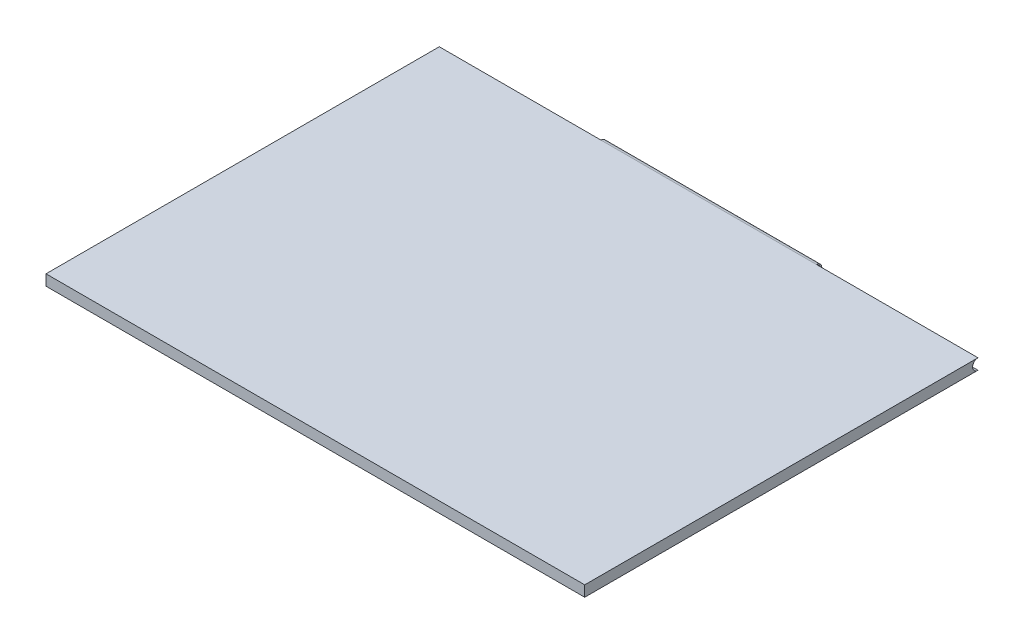
ISO-10303-21;
HEADER;
FILE_DESCRIPTION(('STEP AP214'),'2;1');
FILE_NAME('part.step','',(''),(''),'','','');
FILE_SCHEMA(('AUTOMOTIVE_DESIGN { 1 0 10303 214 1 1 1 1 }'));
ENDSEC;
DATA;
#1=APPLICATION_CONTEXT('core data for automotive mechanical design processes');
#2=APPLICATION_PROTOCOL_DEFINITION('international standard','automotive_design',2000,#1);
#3=PRODUCT_CONTEXT('',#1,'mechanical');
#4=PRODUCT('Part','Part','',(#3));
#5=PRODUCT_RELATED_PRODUCT_CATEGORY('part','',(#4));
#6=PRODUCT_DEFINITION_FORMATION('','',#4);
#7=PRODUCT_DEFINITION_CONTEXT('part definition',#1,'design');
#8=PRODUCT_DEFINITION('design','',#6,#7);
#9=PRODUCT_DEFINITION_SHAPE('','',#8);
#10=(LENGTH_UNIT() NAMED_UNIT(*) SI_UNIT(.MILLI.,.METRE.));
#11=(NAMED_UNIT(*) PLANE_ANGLE_UNIT() SI_UNIT($,.RADIAN.));
#12=(NAMED_UNIT(*) SI_UNIT($,.STERADIAN.) SOLID_ANGLE_UNIT());
#13=UNCERTAINTY_MEASURE_WITH_UNIT(LENGTH_MEASURE(1.E-05),#10,'distance_accuracy_value','');
#14=(GEOMETRIC_REPRESENTATION_CONTEXT(3) GLOBAL_UNCERTAINTY_ASSIGNED_CONTEXT((#13)) GLOBAL_UNIT_ASSIGNED_CONTEXT((#10,
#11,#12)) REPRESENTATION_CONTEXT('',''));
#15=CARTESIAN_POINT('',(0.,0.,0.));
#16=DIRECTION('',(0.,0.,1.));
#17=DIRECTION('',(1.,0.,0.));
#18=AXIS2_PLACEMENT_3D('',#15,#16,#17);
#19=CARTESIAN_POINT('',(-95.260663507109,2.,-80.1232227488151));
#20=DIRECTION('',(1.,0.,0.));
#21=DIRECTION('',(0.,0.,-1.));
#22=AXIS2_PLACEMENT_3D('',#19,#20,#21);
#23=CYLINDRICAL_SURFACE('',#22,2.);
#24=DIRECTION('',(-1.,0.,0.));
#25=VECTOR('',#24,1.);
#26=CARTESIAN_POINT('',(-95.260663507109,0.,-80.1232227488151));
#27=LINE('',#26,#25);
#28=CARTESIAN_POINT('',(44.739336492891,0.,-80.1232227488151));
#29=VERTEX_POINT('',#28);
#30=CARTESIAN_POINT('',(-35.260663507109,0.,-80.1232227488151));
#31=VERTEX_POINT('',#30);
#32=EDGE_CURVE('E124',#29,#31,#27,.T.);
#33=ORIENTED_EDGE('',*,*,#32,.T.);
#34=CARTESIAN_POINT('',(-35.260663507109,2.,-80.1232227488152));
#35=DIRECTION('',(-1.,0.,0.));
#36=DIRECTION('',(0.,0.,1.));
#37=AXIS2_PLACEMENT_3D('',#34,#35,#36);
#38=CIRCLE('',#37,2.);
#39=CARTESIAN_POINT('',(-35.260663507109,4.,-80.1232227488152));
#40=VERTEX_POINT('',#39);
#41=EDGE_CURVE('E56',#40,#31,#38,.T.);
#42=ORIENTED_EDGE('',*,*,#41,.F.);
#43=DIRECTION('',(-1.,0.,0.));
#44=VECTOR('',#43,1.);
#45=CARTESIAN_POINT('',(-95.260663507109,4.,-80.1232227488151));
#46=LINE('',#45,#44);
#47=CARTESIAN_POINT('',(44.739336492891,4.,-80.1232227488151));
#48=VERTEX_POINT('',#47);
#49=EDGE_CURVE('E115',#48,#40,#46,.T.);
#50=ORIENTED_EDGE('',*,*,#49,.F.);
#51=CARTESIAN_POINT('',(44.739336492891,2.,-80.1232227488151));
#52=DIRECTION('',(1.,0.,0.));
#53=DIRECTION('',(0.,0.,-1.));
#54=AXIS2_PLACEMENT_3D('',#51,#52,#53);
#55=CIRCLE('',#54,2.);
#56=EDGE_CURVE('E157',#29,#48,#55,.T.);
#57=ORIENTED_EDGE('',*,*,#56,.F.);
#58=EDGE_LOOP('',(#33,#42,#50,#57));
#59=FACE_BOUND('',#58,.T.);
#60=ADVANCED_FACE('F41',(#59),#23,.T.);
#61=CARTESIAN_POINT('',(-95.260663507109,2.,-80.1232227488151));
#62=DIRECTION('',(1.,0.,0.));
#63=DIRECTION('',(0.,0.,-1.));
#64=AXIS2_PLACEMENT_3D('',#61,#62,#63);
#65=CYLINDRICAL_SURFACE('',#64,1.5);
#66=CARTESIAN_POINT('',(44.739336492891,2.,-80.1232227488151));
#67=DIRECTION('',(1.,0.,0.));
#68=DIRECTION('',(0.,0.,-1.));
#69=AXIS2_PLACEMENT_3D('',#66,#67,#68);
#70=CIRCLE('',#69,1.5);
#71=CARTESIAN_POINT('',(44.739336492891,2.,-81.6232227488151));
#72=VERTEX_POINT('',#71);
#73=EDGE_CURVE('E45',#72,#72,#70,.F.);
#74=ORIENTED_EDGE('',*,*,#73,.F.);
#75=EDGE_LOOP('',(#74));
#76=FACE_BOUND('',#75,.T.);
#77=CARTESIAN_POINT('',(-35.260663507109,2.,-80.1232227488151));
#78=DIRECTION('',(-1.,0.,0.));
#79=DIRECTION('',(0.,0.,1.));
#80=AXIS2_PLACEMENT_3D('',#77,#78,#79);
#81=CIRCLE('',#80,1.5);
#82=CARTESIAN_POINT('',(-35.260663507109,2.,-78.6232227488151));
#83=VERTEX_POINT('',#82);
#84=EDGE_CURVE('E117',#83,#83,#81,.F.);
#85=ORIENTED_EDGE('',*,*,#84,.F.);
#86=EDGE_LOOP('',(#85));
#87=FACE_BOUND('',#86,.T.);
#88=ADVANCED_FACE('F167',(#76,#87),#65,.F.);
#89=CARTESIAN_POINT('',(-95.260663507109,4.,-80.1232227488151));
#90=DIRECTION('',(1.,0.,0.));
#91=DIRECTION('',(0.,0.,-1.));
#92=AXIS2_PLACEMENT_3D('',#89,#90,#91);
#93=PLANE('',#92);
#94=DIRECTION('',(0.,0.,1.));
#95=VECTOR('',#94,1.);
#96=CARTESIAN_POINT('',(-95.260663507109,4.,-80.1232227488151));
#97=LINE('',#96,#95);
#98=CARTESIAN_POINT('',(-95.260663507109,4.,-80.1232227488151));
#99=VERTEX_POINT('',#98);
#100=CARTESIAN_POINT('',(-95.260663507109,4.,65.8767772511848));
#101=VERTEX_POINT('',#100);
#102=EDGE_CURVE('E111',#99,#101,#97,.T.);
#103=ORIENTED_EDGE('',*,*,#102,.F.);
#104=CARTESIAN_POINT('',(-95.260663507109,2.,-80.1232227488151));
#105=DIRECTION('',(-1.,0.,0.));
#106=DIRECTION('',(0.,0.,1.));
#107=AXIS2_PLACEMENT_3D('',#104,#105,#106);
#108=CIRCLE('',#107,2.);
#109=CARTESIAN_POINT('',(-95.260663507109,0.,-80.1232227488151));
#110=VERTEX_POINT('',#109);
#111=EDGE_CURVE('E95',#110,#99,#108,.T.);
#112=ORIENTED_EDGE('',*,*,#111,.F.);
#113=DIRECTION('',(0.,0.,1.));
#114=VECTOR('',#113,1.);
#115=CARTESIAN_POINT('',(-95.260663507109,0.,-80.1232227488151));
#116=LINE('',#115,#114);
#117=CARTESIAN_POINT('',(-95.260663507109,0.,65.8767772511848));
#118=VERTEX_POINT('',#117);
#119=EDGE_CURVE('E133',#110,#118,#116,.T.);
#120=ORIENTED_EDGE('',*,*,#119,.T.);
#121=DIRECTION('',(0.,-1.,0.));
#122=VECTOR('',#121,1.);
#123=CARTESIAN_POINT('',(-95.260663507109,4.,65.8767772511848));
#124=LINE('',#123,#122);
#125=EDGE_CURVE('E12',#101,#118,#124,.T.);
#126=ORIENTED_EDGE('',*,*,#125,.F.);
#127=EDGE_LOOP('',(#103,#112,#120,#126));
#128=FACE_BOUND('',#127,.T.);
#129=ADVANCED_FACE('F43',(#128),#93,.F.);
#130=CARTESIAN_POINT('',(-95.260663507109,4.,65.8767772511848));
#131=DIRECTION('',(0.,0.,-1.));
#132=DIRECTION('',(-1.,0.,0.));
#133=AXIS2_PLACEMENT_3D('',#130,#131,#132);
#134=PLANE('',#133);
#135=DIRECTION('',(1.,0.,0.));
#136=VECTOR('',#135,1.);
#137=CARTESIAN_POINT('',(-95.260663507109,0.,65.8767772511848));
#138=LINE('',#137,#136);
#139=CARTESIAN_POINT('',(104.739336492891,0.,65.8767772511848));
#140=VERTEX_POINT('',#139);
#141=EDGE_CURVE('E135',#118,#140,#138,.T.);
#142=ORIENTED_EDGE('',*,*,#141,.T.);
#143=DIRECTION('',(0.,-1.,0.));
#144=VECTOR('',#143,1.);
#145=CARTESIAN_POINT('',(104.739336492891,4.,65.8767772511848));
#146=LINE('',#145,#144);
#147=CARTESIAN_POINT('',(104.739336492891,4.,65.8767772511848));
#148=VERTEX_POINT('',#147);
#149=EDGE_CURVE('E50',#148,#140,#146,.T.);
#150=ORIENTED_EDGE('',*,*,#149,.F.);
#151=DIRECTION('',(1.,0.,0.));
#152=VECTOR('',#151,1.);
#153=CARTESIAN_POINT('',(-95.260663507109,4.,65.8767772511848));
#154=LINE('',#153,#152);
#155=EDGE_CURVE('E119',#101,#148,#154,.T.);
#156=ORIENTED_EDGE('',*,*,#155,.F.);
#157=ORIENTED_EDGE('',*,*,#125,.T.);
#158=EDGE_LOOP('',(#142,#150,#156,#157));
#159=FACE_BOUND('',#158,.T.);
#160=ADVANCED_FACE('F175',(#159),#134,.F.);
#161=CARTESIAN_POINT('',(104.739336492891,4.,-80.1232227488151));
#162=DIRECTION('',(-1.,0.,0.));
#163=DIRECTION('',(0.,0.,1.));
#164=AXIS2_PLACEMENT_3D('',#161,#162,#163);
#165=PLANE('',#164);
#166=DIRECTION('',(0.,0.,-1.));
#167=VECTOR('',#166,1.);
#168=CARTESIAN_POINT('',(104.739336492891,0.,-80.1232227488151));
#169=LINE('',#168,#167);
#170=CARTESIAN_POINT('',(104.739336492891,0.,-80.1232227488151));
#171=VERTEX_POINT('',#170);
#172=EDGE_CURVE('E137',#140,#171,#169,.T.);
#173=ORIENTED_EDGE('',*,*,#172,.T.);
#174=CARTESIAN_POINT('',(104.739336492891,2.,-80.1232227488151));
#175=DIRECTION('',(1.,0.,0.));
#176=DIRECTION('',(0.,0.,-1.));
#177=AXIS2_PLACEMENT_3D('',#174,#175,#176);
#178=CIRCLE('',#177,2.);
#179=CARTESIAN_POINT('',(104.739336492891,4.,-80.1232227488151));
#180=VERTEX_POINT('',#179);
#181=EDGE_CURVE('E116',#180,#171,#178,.T.);
#182=ORIENTED_EDGE('',*,*,#181,.F.);
#183=DIRECTION('',(0.,0.,-1.));
#184=VECTOR('',#183,1.);
#185=CARTESIAN_POINT('',(104.739336492891,4.,-80.1232227488151));
#186=LINE('',#185,#184);
#187=EDGE_CURVE('E122',#148,#180,#186,.T.);
#188=ORIENTED_EDGE('',*,*,#187,.F.);
#189=ORIENTED_EDGE('',*,*,#149,.T.);
#190=EDGE_LOOP('',(#173,#182,#188,#189));
#191=FACE_BOUND('',#190,.T.);
#192=ADVANCED_FACE('F145',(#191),#165,.F.);
#193=CARTESIAN_POINT('',(0.,4.,0.));
#194=DIRECTION('',(0.,1.,0.));
#195=DIRECTION('',(0.,0.,1.));
#196=AXIS2_PLACEMENT_3D('',#193,#194,#195);
#197=PLANE('',#196);
#198=ORIENTED_EDGE('',*,*,#102,.T.);
#199=ORIENTED_EDGE('',*,*,#155,.T.);
#200=ORIENTED_EDGE('',*,*,#187,.T.);
#201=EDGE_CURVE('E131',#180,#48,#46,.T.);
#202=ORIENTED_EDGE('',*,*,#201,.T.);
#203=ORIENTED_EDGE('',*,*,#49,.T.);
#204=DIRECTION('',(-1.,0.,0.));
#205=VECTOR('',#204,1.);
#206=CARTESIAN_POINT('',(-35.260663507109,4.,-80.1232227488152));
#207=LINE('',#206,#205);
#208=EDGE_CURVE('E98',#40,#99,#207,.T.);
#209=ORIENTED_EDGE('',*,*,#208,.T.);
#210=EDGE_LOOP('',(#198,#199,#200,#202,#203,#209));
#211=FACE_BOUND('',#210,.T.);
#212=ADVANCED_FACE('F110',(#211),#197,.T.);
#213=CARTESIAN_POINT('',(0.,0.,0.));
#214=DIRECTION('',(0.,1.,0.));
#215=DIRECTION('',(0.,0.,1.));
#216=AXIS2_PLACEMENT_3D('',#213,#214,#215);
#217=PLANE('',#216);
#218=ORIENTED_EDGE('',*,*,#119,.F.);
#219=EDGE_CURVE('E100',#31,#110,#27,.T.);
#220=ORIENTED_EDGE('',*,*,#219,.F.);
#221=ORIENTED_EDGE('',*,*,#32,.F.);
#222=EDGE_CURVE('E120',#171,#29,#27,.T.);
#223=ORIENTED_EDGE('',*,*,#222,.F.);
#224=ORIENTED_EDGE('',*,*,#172,.F.);
#225=ORIENTED_EDGE('',*,*,#141,.F.);
#226=EDGE_LOOP('',(#218,#220,#221,#223,#224,#225));
#227=FACE_BOUND('',#226,.T.);
#228=ADVANCED_FACE('F150',(#227),#217,.F.);
#229=CARTESIAN_POINT('',(44.739336492891,2.,-80.1232227488151));
#230=DIRECTION('',(1.,0.,0.));
#231=DIRECTION('',(0.,0.,-1.));
#232=AXIS2_PLACEMENT_3D('',#229,#230,#231);
#233=PLANE('',#232);
#234=EDGE_CURVE('E63',#48,#29,#55,.T.);
#235=ORIENTED_EDGE('',*,*,#234,.T.);
#236=ORIENTED_EDGE('',*,*,#56,.T.);
#237=EDGE_LOOP('',(#235,#236));
#238=FACE_BOUND('',#237,.T.);
#239=ORIENTED_EDGE('',*,*,#73,.T.);
#240=EDGE_LOOP('',(#239));
#241=FACE_BOUND('',#240,.T.);
#242=ADVANCED_FACE('F185',(#238,#241),#233,.T.);
#243=CARTESIAN_POINT('',(44.739336492891,2.,-80.1232227488151));
#244=DIRECTION('',(1.,0.,0.));
#245=DIRECTION('',(0.,0.,-1.));
#246=AXIS2_PLACEMENT_3D('',#243,#244,#245);
#247=CYLINDRICAL_SURFACE('',#246,2.);
#248=ORIENTED_EDGE('',*,*,#201,.F.);
#249=ORIENTED_EDGE('',*,*,#181,.T.);
#250=ORIENTED_EDGE('',*,*,#222,.T.);
#251=ORIENTED_EDGE('',*,*,#234,.F.);
#252=EDGE_LOOP('',(#248,#249,#250,#251));
#253=FACE_BOUND('',#252,.T.);
#254=ADVANCED_FACE('F155',(#253),#247,.F.);
#255=CARTESIAN_POINT('',(-35.260663507109,2.,-80.1232227488152));
#256=DIRECTION('',(-1.,0.,0.));
#257=DIRECTION('',(0.,0.,1.));
#258=AXIS2_PLACEMENT_3D('',#255,#256,#257);
#259=CYLINDRICAL_SURFACE('',#258,2.);
#260=EDGE_CURVE('E105',#31,#40,#38,.T.);
#261=ORIENTED_EDGE('',*,*,#260,.F.);
#262=ORIENTED_EDGE('',*,*,#219,.T.);
#263=ORIENTED_EDGE('',*,*,#111,.T.);
#264=ORIENTED_EDGE('',*,*,#208,.F.);
#265=EDGE_LOOP('',(#261,#262,#263,#264));
#266=FACE_BOUND('',#265,.T.);
#267=ADVANCED_FACE('F97',(#266),#259,.F.);
#268=CARTESIAN_POINT('',(-35.260663507109,2.,-80.1232227488152));
#269=DIRECTION('',(-1.,0.,0.));
#270=DIRECTION('',(0.,0.,1.));
#271=AXIS2_PLACEMENT_3D('',#268,#269,#270);
#272=PLANE('',#271);
#273=ORIENTED_EDGE('',*,*,#41,.T.);
#274=ORIENTED_EDGE('',*,*,#260,.T.);
#275=EDGE_LOOP('',(#273,#274));
#276=FACE_BOUND('',#275,.T.);
#277=ORIENTED_EDGE('',*,*,#84,.T.);
#278=EDGE_LOOP('',(#277));
#279=FACE_BOUND('',#278,.T.);
#280=ADVANCED_FACE('F161',(#276,#279),#272,.T.);
#281=CLOSED_SHELL('',(#60,#88,#129,#160,#192,#212,#228,#242,#254,#267,#280));
#282=MANIFOLD_SOLID_BREP('B2',#281);
#283=ADVANCED_BREP_SHAPE_REPRESENTATION('',(#18,#282),#14);
#284=SHAPE_DEFINITION_REPRESENTATION(#9,#283);
ENDSEC;
END-ISO-10303-21;
